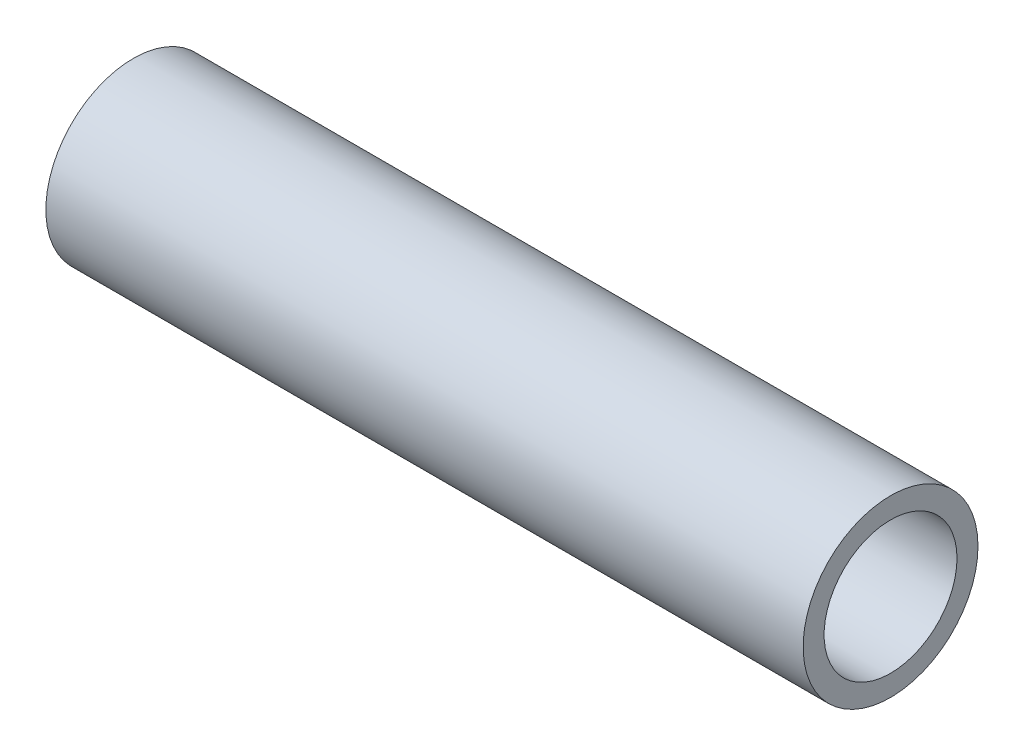
ISO-10303-21;
HEADER;
FILE_DESCRIPTION(('STEP AP214'),'2;1');
FILE_NAME('part.step','',(''),(''),'','','');
FILE_SCHEMA(('AUTOMOTIVE_DESIGN { 1 0 10303 214 1 1 1 1 }'));
ENDSEC;
DATA;
#1=APPLICATION_CONTEXT('core data for automotive mechanical design processes');
#2=APPLICATION_PROTOCOL_DEFINITION('international standard','automotive_design',2000,#1);
#3=PRODUCT_CONTEXT('',#1,'mechanical');
#4=PRODUCT('Part','Part','',(#3));
#5=PRODUCT_RELATED_PRODUCT_CATEGORY('part','',(#4));
#6=PRODUCT_DEFINITION_FORMATION('','',#4);
#7=PRODUCT_DEFINITION_CONTEXT('part definition',#1,'design');
#8=PRODUCT_DEFINITION('design','',#6,#7);
#9=PRODUCT_DEFINITION_SHAPE('','',#8);
#10=(LENGTH_UNIT() NAMED_UNIT(*) SI_UNIT(.MILLI.,.METRE.));
#11=(NAMED_UNIT(*) PLANE_ANGLE_UNIT() SI_UNIT($,.RADIAN.));
#12=(NAMED_UNIT(*) SI_UNIT($,.STERADIAN.) SOLID_ANGLE_UNIT());
#13=UNCERTAINTY_MEASURE_WITH_UNIT(LENGTH_MEASURE(1.E-05),#10,'distance_accuracy_value','');
#14=(GEOMETRIC_REPRESENTATION_CONTEXT(3) GLOBAL_UNCERTAINTY_ASSIGNED_CONTEXT((#13)) GLOBAL_UNIT_ASSIGNED_CONTEXT((#10,
#11,#12)) REPRESENTATION_CONTEXT('',''));
#15=CARTESIAN_POINT('',(0.,0.,0.));
#16=DIRECTION('',(0.,0.,1.));
#17=DIRECTION('',(1.,0.,0.));
#18=AXIS2_PLACEMENT_3D('',#15,#16,#17);
#19=CARTESIAN_POINT('',(110.,0.,0.));
#20=DIRECTION('',(1.,0.,0.));
#21=DIRECTION('',(0.,0.,-1.));
#22=AXIS2_PLACEMENT_3D('',#19,#20,#21);
#23=PLANE('',#22);
#24=CARTESIAN_POINT('',(110.,0.,0.));
#25=DIRECTION('',(1.,0.,0.));
#26=DIRECTION('',(0.,0.,-1.));
#27=AXIS2_PLACEMENT_3D('',#24,#25,#26);
#28=CIRCLE('',#27,12.7);
#29=CARTESIAN_POINT('',(110.,0.,-12.7));
#30=VERTEX_POINT('',#29);
#31=EDGE_CURVE('E10',#30,#30,#28,.T.);
#32=ORIENTED_EDGE('',*,*,#31,.T.);
#33=EDGE_LOOP('',(#32));
#34=FACE_BOUND('',#33,.T.);
#35=CARTESIAN_POINT('',(110.,0.,0.));
#36=DIRECTION('',(1.,0.,0.));
#37=DIRECTION('',(0.,0.,-1.));
#38=AXIS2_PLACEMENT_3D('',#35,#36,#37);
#39=CIRCLE('',#38,9.652);
#40=CARTESIAN_POINT('',(110.,0.,-9.652));
#41=VERTEX_POINT('',#40);
#42=EDGE_CURVE('E45',#41,#41,#39,.T.);
#43=ORIENTED_EDGE('',*,*,#42,.F.);
#44=EDGE_LOOP('',(#43));
#45=FACE_BOUND('',#44,.T.);
#46=ADVANCED_FACE('F34',(#34,#45),#23,.T.);
#47=CARTESIAN_POINT('',(0.,0.,0.));
#48=DIRECTION('',(1.,0.,0.));
#49=DIRECTION('',(0.,0.,-1.));
#50=AXIS2_PLACEMENT_3D('',#47,#48,#49);
#51=PLANE('',#50);
#52=CARTESIAN_POINT('',(0.,0.,0.));
#53=DIRECTION('',(1.,0.,0.));
#54=DIRECTION('',(0.,0.,-1.));
#55=AXIS2_PLACEMENT_3D('',#52,#53,#54);
#56=CIRCLE('',#55,12.7);
#57=CARTESIAN_POINT('',(0.,0.,-12.7));
#58=VERTEX_POINT('',#57);
#59=EDGE_CURVE('E38',#58,#58,#56,.T.);
#60=ORIENTED_EDGE('',*,*,#59,.F.);
#61=EDGE_LOOP('',(#60));
#62=FACE_BOUND('',#61,.T.);
#63=CARTESIAN_POINT('',(0.,0.,0.));
#64=DIRECTION('',(1.,0.,0.));
#65=DIRECTION('',(0.,0.,-1.));
#66=AXIS2_PLACEMENT_3D('',#63,#64,#65);
#67=CIRCLE('',#66,9.652);
#68=CARTESIAN_POINT('',(0.,0.,-9.652));
#69=VERTEX_POINT('',#68);
#70=EDGE_CURVE('E47',#69,#69,#67,.T.);
#71=ORIENTED_EDGE('',*,*,#70,.T.);
#72=EDGE_LOOP('',(#71));
#73=FACE_BOUND('',#72,.T.);
#74=ADVANCED_FACE('F57',(#62,#73),#51,.F.);
#75=CARTESIAN_POINT('',(110.,0.,0.));
#76=DIRECTION('',(-1.,0.,0.));
#77=DIRECTION('',(0.,0.,1.));
#78=AXIS2_PLACEMENT_3D('',#75,#76,#77);
#79=CYLINDRICAL_SURFACE('',#78,12.7);
#80=ORIENTED_EDGE('',*,*,#31,.F.);
#81=EDGE_LOOP('',(#80));
#82=FACE_BOUND('',#81,.T.);
#83=ORIENTED_EDGE('',*,*,#59,.T.);
#84=EDGE_LOOP('',(#83));
#85=FACE_BOUND('',#84,.T.);
#86=ADVANCED_FACE('F36',(#82,#85),#79,.T.);
#87=CARTESIAN_POINT('',(110.,0.,0.));
#88=DIRECTION('',(-1.,0.,0.));
#89=DIRECTION('',(0.,0.,1.));
#90=AXIS2_PLACEMENT_3D('',#87,#88,#89);
#91=CYLINDRICAL_SURFACE('',#90,9.652);
#92=ORIENTED_EDGE('',*,*,#42,.T.);
#93=EDGE_LOOP('',(#92));
#94=FACE_BOUND('',#93,.T.);
#95=ORIENTED_EDGE('',*,*,#70,.F.);
#96=EDGE_LOOP('',(#95));
#97=FACE_BOUND('',#96,.T.);
#98=ADVANCED_FACE('F53',(#94,#97),#91,.F.);
#99=CLOSED_SHELL('',(#46,#74,#86,#98));
#100=MANIFOLD_SOLID_BREP('B2',#99);
#101=ADVANCED_BREP_SHAPE_REPRESENTATION('',(#18,#100),#14);
#102=SHAPE_DEFINITION_REPRESENTATION(#9,#101);
ENDSEC;
END-ISO-10303-21;
